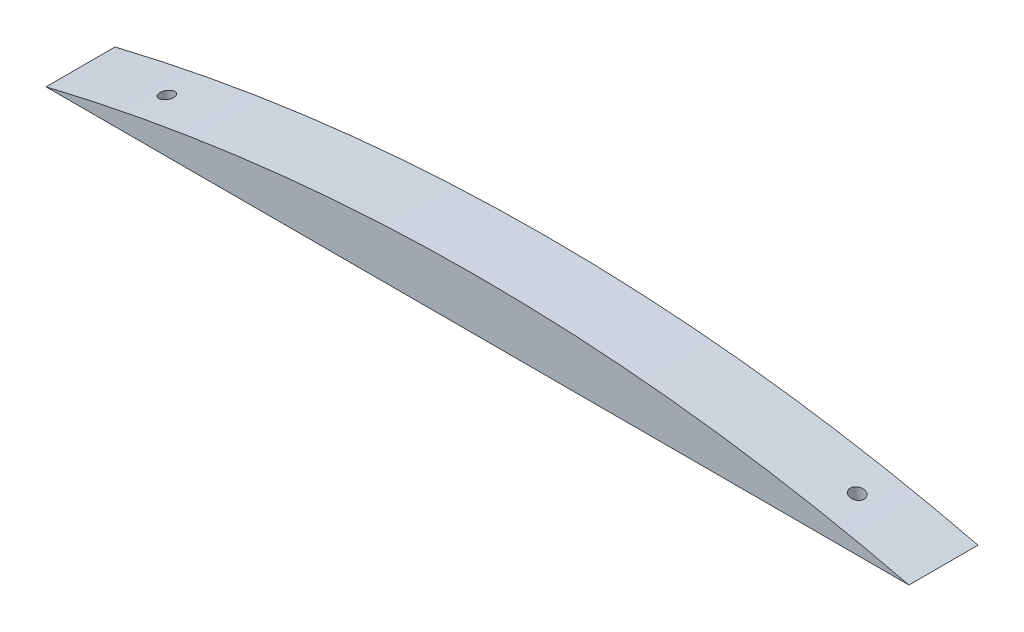
ISO-10303-21;
HEADER;
FILE_DESCRIPTION(('STEP AP214'),'2;1');
FILE_NAME('part.step','',(''),(''),'','','');
FILE_SCHEMA(('AUTOMOTIVE_DESIGN { 1 0 10303 214 1 1 1 1 }'));
ENDSEC;
DATA;
#1=APPLICATION_CONTEXT('core data for automotive mechanical design processes');
#2=APPLICATION_PROTOCOL_DEFINITION('international standard','automotive_design',2000,#1);
#3=PRODUCT_CONTEXT('',#1,'mechanical');
#4=PRODUCT('Part','Part','',(#3));
#5=PRODUCT_RELATED_PRODUCT_CATEGORY('part','',(#4));
#6=PRODUCT_DEFINITION_FORMATION('','',#4);
#7=PRODUCT_DEFINITION_CONTEXT('part definition',#1,'design');
#8=PRODUCT_DEFINITION('design','',#6,#7);
#9=PRODUCT_DEFINITION_SHAPE('','',#8);
#10=(LENGTH_UNIT() NAMED_UNIT(*) SI_UNIT(.MILLI.,.METRE.));
#11=(NAMED_UNIT(*) PLANE_ANGLE_UNIT() SI_UNIT($,.RADIAN.));
#12=(NAMED_UNIT(*) SI_UNIT($,.STERADIAN.) SOLID_ANGLE_UNIT());
#13=UNCERTAINTY_MEASURE_WITH_UNIT(LENGTH_MEASURE(1.E-05),#10,'distance_accuracy_value','');
#14=(GEOMETRIC_REPRESENTATION_CONTEXT(3) GLOBAL_UNCERTAINTY_ASSIGNED_CONTEXT((#13)) GLOBAL_UNIT_ASSIGNED_CONTEXT((#10,
#11,#12)) REPRESENTATION_CONTEXT('',''));
#15=CARTESIAN_POINT('',(0.,0.,0.));
#16=DIRECTION('',(0.,0.,1.));
#17=DIRECTION('',(1.,0.,0.));
#18=AXIS2_PLACEMENT_3D('',#15,#16,#17);
#19=CARTESIAN_POINT('',(0.,-653.137655014644,25.4));
#20=DIRECTION('',(0.,0.,-1.));
#21=DIRECTION('',(-1.,0.,0.));
#22=AXIS2_PLACEMENT_3D('',#19,#20,#21);
#23=CYLINDRICAL_SURFACE('',#22,672.153523309987);
#24=CARTESIAN_POINT('',(127.,6.90882736218701,10.1473));
#25=CARTESIAN_POINT('',(126.854700101575,6.93678454536345,10.1473061208971));
#26=CARTESIAN_POINT('',(126.709286225705,6.96471351699934,10.1597435254156));
#27=CARTESIAN_POINT('',(126.422409940531,7.01971604598845,10.2092369264156));
#28=CARTESIAN_POINT('',(126.280952492603,7.04678853443477,10.2463225057243));
#29=CARTESIAN_POINT('',(126.006153275248,7.09929321065845,10.344197011836));
#30=CARTESIAN_POINT('',(125.872810956681,7.12472550943216,10.4049843327083));
#31=CARTESIAN_POINT('',(125.618187510461,7.17321622814044,10.5486665503839));
#32=CARTESIAN_POINT('',(125.496902947135,7.19627532434909,10.631555124845));
#33=CARTESIAN_POINT('',(125.270989594477,7.23917013482297,10.8164084190503));
#34=CARTESIAN_POINT('',(125.166226156185,7.25903193835387,10.9182024193038));
#35=CARTESIAN_POINT('',(124.975322583409,7.29518571043773,11.1385262737965));
#36=CARTESIAN_POINT('',(124.889181544497,7.3114778523578,11.257055314808));
#37=CARTESIAN_POINT('',(124.739546486385,7.33975577424142,11.5053138013222));
#38=CARTESIAN_POINT('',(124.675691095118,7.35181029513668,11.6348176052773));
#39=CARTESIAN_POINT('',(124.570632275929,7.37163284612877,11.9030149295354));
#40=CARTESIAN_POINT('',(124.529426618924,7.37940129804143,12.0417075440112));
#41=CARTESIAN_POINT('',(124.471440733974,7.39033092126114,12.3220556362525));
#42=CARTESIAN_POINT('',(124.454295454136,7.39356095193723,12.4636330077915));
#43=CARTESIAN_POINT('',(124.443791960294,7.3955398911566,12.7476949764835));
#44=CARTESIAN_POINT('',(124.45043241606,7.39428905029467,12.8901795224576));
#45=CARTESIAN_POINT('',(124.487154718318,7.38736914850022,13.1709453755319));
#46=CARTESIAN_POINT('',(124.517069379925,7.38173159844247,13.3092493814936));
#47=CARTESIAN_POINT('',(124.599204714802,7.36624263841227,13.5788132657685));
#48=CARTESIAN_POINT('',(124.651425515297,7.35639120440586,13.7100731039004));
#49=CARTESIAN_POINT('',(124.776823109317,7.33271326810261,13.9624142615329));
#50=CARTESIAN_POINT('',(124.850080739021,7.31887143145508,14.083453941725));
#51=CARTESIAN_POINT('',(125.015272707523,7.28762276670692,14.3115096704759));
#52=CARTESIAN_POINT('',(125.107208116307,7.27021573436803,14.4185249150449));
#53=CARTESIAN_POINT('',(125.308404682925,7.23206961704948,14.6170329449244));
#54=CARTESIAN_POINT('',(125.417878268652,7.21128963078805,14.7083024991504));
#55=CARTESIAN_POINT('',(125.650099376491,7.16714231519868,14.8712135100901));
#56=CARTESIAN_POINT('',(125.772848059881,7.14377475951136,14.9428532476889));
#57=CARTESIAN_POINT('',(126.030381367178,7.09466722077415,15.0657597764567));
#58=CARTESIAN_POINT('',(126.165336117977,7.06889346092385,15.1166566441091));
#59=CARTESIAN_POINT('',(126.441639536331,7.01603199209656,15.1950225324117));
#60=CARTESIAN_POINT('',(126.582988741072,6.98894417271402,15.2224895809036));
#61=CARTESIAN_POINT('',(126.870190507144,6.9338072739755,15.2535423550247));
#62=CARTESIAN_POINT('',(127.016078434469,6.90575003742884,15.2567872870999));
#63=CARTESIAN_POINT('',(127.30632409582,6.84983016401336,15.2384227938138));
#64=CARTESIAN_POINT('',(127.450681760097,6.82196753603434,15.2168122404171));
#65=CARTESIAN_POINT('',(127.734479167796,6.76709775316887,15.1491220329108));
#66=CARTESIAN_POINT('',(127.873891964863,6.74009534906186,15.1029253698558));
#67=CARTESIAN_POINT('',(128.14303244057,6.68788324758169,14.9871839148885));
#68=CARTESIAN_POINT('',(128.272760315688,6.66267351384089,14.9176395967906));
#69=CARTESIAN_POINT('',(128.517817011597,6.61498431699523,14.7576134261498));
#70=CARTESIAN_POINT('',(128.633240742878,6.59248688776136,14.6672823694479));
#71=CARTESIAN_POINT('',(128.847247817205,6.55072410006355,14.4678626804833));
#72=CARTESIAN_POINT('',(128.94583256849,6.53145847132734,14.3587756183134));
#73=CARTESIAN_POINT('',(129.121634305426,6.49706994397843,14.1268082745688));
#74=CARTESIAN_POINT('',(129.19917103291,6.48188509441243,14.0041795540467));
#75=CARTESIAN_POINT('',(129.332504229616,6.45575526683165,13.7472090732067));
#76=CARTESIAN_POINT('',(129.388303076149,6.44480982518505,13.6128685956843));
#77=CARTESIAN_POINT('',(129.475560120204,6.42768684625079,13.3388886861255));
#78=CARTESIAN_POINT('',(129.507437868105,6.42142713142162,13.1993879336195));
#79=CARTESIAN_POINT('',(129.547465184423,6.41356633805432,12.9168971284652));
#80=CARTESIAN_POINT('',(129.555616573535,6.41196490205305,12.7739073444046));
#81=CARTESIAN_POINT('',(129.547975444709,6.41346579904888,12.4902242408473));
#82=CARTESIAN_POINT('',(129.532453321905,6.41651501306522,12.3495232640924));
#83=CARTESIAN_POINT('',(129.478456092184,6.42711743274922,12.0727773936751));
#84=CARTESIAN_POINT('',(129.439981255427,6.43467058540459,11.9367324452302));
#85=CARTESIAN_POINT('',(129.341251671023,6.45403840536872,11.6730382761214));
#86=CARTESIAN_POINT('',(129.280985283875,6.46585535008587,11.5453935854286));
#87=CARTESIAN_POINT('',(129.14051356388,6.4933719662133,11.3020670712205));
#88=CARTESIAN_POINT('',(129.060308046569,6.50907167354469,11.1863853583939));
#89=CARTESIAN_POINT('',(128.881267462921,6.54407596660032,10.9687580323191));
#90=CARTESIAN_POINT('',(128.782223362392,6.56342097600859,10.8669909799622));
#91=CARTESIAN_POINT('',(128.56899311307,6.60501048984521,10.6814564373152));
#92=CARTESIAN_POINT('',(128.454801936961,6.62725595689415,10.5976949473689));
#93=CARTESIAN_POINT('',(128.212316999387,6.67442140546855,10.4489623545031));
#94=CARTESIAN_POINT('',(128.083803208551,6.69938291710809,10.3843635929602));
#95=CARTESIAN_POINT('',(127.81815222857,6.7508939828394,10.2777386943378));
#96=CARTESIAN_POINT('',(127.681024487029,6.77744179560141,10.2356882934006));
#97=CARTESIAN_POINT('',(127.452585189602,6.82159045336088,10.1860896756876));
#98=CARTESIAN_POINT('',(127.362680788653,6.83894677893857,10.1715603966087));
#99=CARTESIAN_POINT('',(127.181865819833,6.87381487423845,10.1521635912739));
#100=CARTESIAN_POINT('',(127.090955241204,6.89132664562229,10.1472961684235));
#101=CARTESIAN_POINT('',(127.,6.90882736218701,10.1473));
#102=B_SPLINE_CURVE_WITH_KNOTS('',3,(#24,#25,#26,#27,#28,#29,#30,#31,#32,#33,#34,#35,#36,#37,
#38,#39,#40,#41,#42,#43,#44,#45,#46,#47,#48,#49,#50,#51,#52,#53,#54,#55,#56,#57,#58,#59,#60,#61,
#62,#63,#64,#65,#66,#67,#68,#69,#70,#71,#72,#73,#74,#75,#76,#77,#78,#79,#80,#81,#82,#83,#84,#85,
#86,#87,#88,#89,#90,#91,#92,#93,#94,#95,#96,#97,#98,#99,#100,#101),.UNSPECIFIED.,.T.,.F.,(4,2,2,
2,2,2,2,2,2,2,2,2,2,2,2,2,2,2,2,2,2,2,2,2,2,2,2,2,2,2,2,2,2,2,2,2,2,2,4),(0.,0.443560341001181,
0.887654008381628,1.33171759106241,1.77565427978665,2.21576154684627,2.65584743455292,
3.08842356539351,3.52095711641816,3.94685444221615,4.37272794988281,4.79557022343372,
5.2184149087052,5.64290667338703,6.06742276260177,6.49753525124427,6.92768539569553,
7.36520237650508,7.80275618079875,8.24645475681865,8.69017347034157,9.136023042675,
9.58186356754148,10.0245664152172,10.4672322216148,10.902740075394,11.3382002875342,
11.7658320133416,12.1934309230346,12.6161823105957,13.0389287223845,13.4619012697067,
13.8848777302772,14.3128547490817,14.7409741706469,15.1769365295542,15.6124288114767,
15.8900869961521,16.167748152436),.UNSPECIFIED.);
#103=CARTESIAN_POINT('',(127.,6.90882736218701,10.1473));
#104=VERTEX_POINT('',#103);
#105=EDGE_CURVE('E77',#104,#104,#102,.T.);
#106=ORIENTED_EDGE('',*,*,#105,.F.);
#107=EDGE_LOOP('',(#106));
#108=FACE_BOUND('',#107,.T.);
#109=CARTESIAN_POINT('',(-127.,6.90882736218701,10.1473));
#110=CARTESIAN_POINT('',(-127.14543521535,6.88084400067459,10.1473061451503));
#111=CARTESIAN_POINT('',(-127.290966652101,6.85279188915541,10.1597668194451));
#112=CARTESIAN_POINT('',(-127.578036842559,6.79736061718882,10.2093344366964));
#113=CARTESIAN_POINT('',(-127.719570509745,6.76998231929638,10.2464714229767));
#114=CARTESIAN_POINT('',(-127.994480004532,6.71671648546843,10.3444600604577));
#115=CARTESIAN_POINT('',(-128.127856723811,6.69082878660581,10.4053091141864));
#116=CARTESIAN_POINT('',(-128.382525477227,6.64132532455161,10.5491211398801));
#117=CARTESIAN_POINT('',(-128.503820963698,6.61770891238381,10.632077769333));
#118=CARTESIAN_POINT('',(-128.729803551915,6.57365286597026,10.817126984463));
#119=CARTESIAN_POINT('',(-128.834617169222,6.5531890596305,10.9190592018516));
#120=CARTESIAN_POINT('',(-129.025588444618,6.51586458302638,11.139695255032));
#121=CARTESIAN_POINT('',(-129.111747058079,6.49900372824636,11.2583982314362));
#122=CARTESIAN_POINT('',(-129.261327646595,6.46970834783496,11.506960730839));
#123=CARTESIAN_POINT('',(-129.325124437455,6.45720088107539,11.6365860858651));
#124=CARTESIAN_POINT('',(-129.430036657572,6.436622369683,11.9050403990413));
#125=CARTESIAN_POINT('',(-129.471154531581,6.42855084686263,12.0438683633565));
#126=CARTESIAN_POINT('',(-129.528886721489,6.41721553154857,12.3242874817643));
#127=CARTESIAN_POINT('',(-129.545899542418,6.41387355133042,12.4657935285936));
#128=CARTESIAN_POINT('',(-129.556165166585,6.41185714965416,12.7496939636543));
#129=CARTESIAN_POINT('',(-129.549419440209,6.41318243934475,12.8920882963662));
#130=CARTESIAN_POINT('',(-129.512535423732,6.42042613299615,13.1725344163853));
#131=CARTESIAN_POINT('',(-129.482583403214,6.42630796299991,13.3106117159567));
#132=CARTESIAN_POINT('',(-129.400451859279,6.44242632032016,13.5797156927915));
#133=CARTESIAN_POINT('',(-129.348272162078,6.45266288168352,13.7107423149211));
#134=CARTESIAN_POINT('',(-129.223008463757,6.47721523358998,13.9626918687753));
#135=CARTESIAN_POINT('',(-129.149833446401,6.49154878382945,14.0835677814336));
#136=CARTESIAN_POINT('',(-128.984869142185,6.52382595337149,14.3113184709069));
#137=CARTESIAN_POINT('',(-128.893078652425,6.54176980596524,14.4181923421982));
#138=CARTESIAN_POINT('',(-128.692089606361,6.58100894866929,14.6165953872837));
#139=CARTESIAN_POINT('',(-128.582657317939,6.60234917982776,14.707878824246));
#140=CARTESIAN_POINT('',(-128.350517116017,6.64755065517763,14.8708287392204));
#141=CARTESIAN_POINT('',(-128.227807957101,6.67141213586585,14.9424933746926));
#142=CARTESIAN_POINT('',(-127.970211137474,6.72142195625703,15.0655243871904));
#143=CARTESIAN_POINT('',(-127.835143194366,6.74760388046155,15.1164997330236));
#144=CARTESIAN_POINT('',(-127.558570329821,6.80112234828074,15.1949839301107));
#145=CARTESIAN_POINT('',(-127.41706486888,6.82845898865392,15.2224908107332));
#146=CARTESIAN_POINT('',(-127.129549073099,6.8839040027096,15.2535633839803));
#147=CARTESIAN_POINT('',(-126.983503548178,6.91201781943827,15.2567946267706));
#148=CARTESIAN_POINT('',(-126.692914914658,6.96785632773291,15.2383407148004));
#149=CARTESIAN_POINT('',(-126.548371863118,6.99558100453424,15.2166546172061));
#150=CARTESIAN_POINT('',(-126.264387063234,7.049958046608,15.1487827289787));
#151=CARTESIAN_POINT('',(-126.124964822342,7.07660634355917,15.1025119243332));
#152=CARTESIAN_POINT('',(-125.855805483273,7.12796874025259,14.9866053275011));
#153=CARTESIAN_POINT('',(-125.726068107605,7.15268289541264,14.9169702050607));
#154=CARTESIAN_POINT('',(-125.481150146862,7.19927057154994,14.7568431645203));
#155=CARTESIAN_POINT('',(-125.365859371249,7.22116563546251,14.66652615549));
#156=CARTESIAN_POINT('',(-125.152107276154,7.26170961330247,14.4671788264668));
#157=CARTESIAN_POINT('',(-125.053644547101,7.28035879911738,14.3581500753639));
#158=CARTESIAN_POINT('',(-124.878052122922,7.31358382038004,14.1263308569729));
#159=CARTESIAN_POINT('',(-124.800606068633,7.32822010057348,14.003788713471));
#160=CARTESIAN_POINT('',(-124.667426524602,7.35337162969296,13.7470367979591));
#161=CARTESIAN_POINT('',(-124.61169084416,7.36388729441314,13.6128282048326));
#162=CARTESIAN_POINT('',(-124.524457937646,7.38033885371042,13.3389663181981));
#163=CARTESIAN_POINT('',(-124.492571685132,7.38634825774493,13.1994412867509));
#164=CARTESIAN_POINT('',(-124.45253470309,7.39389300424836,12.9169103965164));
#165=CARTESIAN_POINT('',(-124.444382342346,7.39542865419569,12.773904777629));
#166=CARTESIAN_POINT('',(-124.452031141687,7.39398756840853,12.4900221064918));
#167=CARTESIAN_POINT('',(-124.467589396434,7.39105659140902,12.3491382022699));
#168=CARTESIAN_POINT('',(-124.521722083137,7.38085371666659,12.0720310098747));
#169=CARTESIAN_POINT('',(-124.560296256714,7.37358186765449,11.9358076693998));
#170=CARTESIAN_POINT('',(-124.659289149477,7.35490591821248,11.6717790197272));
#171=CARTESIAN_POINT('',(-124.719718332774,7.34349983831985,11.5439777777159));
#172=CARTESIAN_POINT('',(-124.86058090983,7.31688494199142,11.3003707642209));
#173=CARTESIAN_POINT('',(-124.941014363653,7.30167611413759,11.1845650287562));
#174=CARTESIAN_POINT('',(-125.120464167303,7.26770288987267,10.9668722068559));
#175=CARTESIAN_POINT('',(-125.219669039499,7.24890240196704,10.8651462340831));
#176=CARTESIAN_POINT('',(-125.433225970689,7.20837284674557,10.6797276525723));
#177=CARTESIAN_POINT('',(-125.547582956779,7.18664282677728,10.5960409331098));
#178=CARTESIAN_POINT('',(-125.790240970143,7.14046038562625,10.4475920298746));
#179=CARTESIAN_POINT('',(-125.918746943549,7.11596777686897,10.3831778008979));
#180=CARTESIAN_POINT('',(-126.184328091871,7.06526261838261,10.2769081808975));
#181=CARTESIAN_POINT('',(-126.321393840054,7.03905195918804,10.2350284454403));
#182=CARTESIAN_POINT('',(-126.549383468801,6.99537750449861,10.1857498961179));
#183=CARTESIAN_POINT('',(-126.638911875533,6.97820852450756,10.1713466745989));
#184=CARTESIAN_POINT('',(-126.818947749852,6.9436443678006,10.1521197665417));
#185=CARTESIAN_POINT('',(-126.909455227054,6.92624918886301,10.1472961741643));
#186=CARTESIAN_POINT('',(-127.,6.90882736218701,10.1473));
#187=B_SPLINE_CURVE_WITH_KNOTS('',3,(#109,#110,#111,#112,#113,#114,#115,#116,#117,#118,#119,
#120,#121,#122,#123,#124,#125,#126,#127,#128,#129,#130,#131,#132,#133,#134,#135,#136,#137,#138,
#139,#140,#141,#142,#143,#144,#145,#146,#147,#148,#149,#150,#151,#152,#153,#154,#155,#156,#157,
#158,#159,#160,#161,#162,#163,#164,#165,#166,#167,#168,#169,#170,#171,#172,#173,#174,#175,#176,
#177,#178,#179,#180,#181,#182,#183,#184,#185,#186),.UNSPECIFIED.,.T.,.F.,(4,2,2,2,2,2,2,2,2,2,2,
2,2,2,2,2,2,2,2,2,2,2,2,2,2,2,2,2,2,2,2,2,2,2,2,2,2,2,4),(0.,0.443974836488026,
0.888491203642314,1.33295889118079,1.77729920100468,2.21804199766639,2.65876221743589,
3.09169579244634,3.52458268876223,3.95022609387621,4.37584315693243,4.79807887617756,
5.22031789667401,5.64441574983438,6.06854101623326,6.49883376627371,6.92916691428367,
7.36729199956761,7.80545387030177,8.24964149537581,8.6938459283798,9.13959651586604,
9.58533432684903,10.0274332772865,10.4694951779342,10.9044783236832,11.3394175657862,
11.7670974357604,12.1947479108612,12.6180466417974,13.0413406208521,13.4648375406512,
13.8883357320471,14.3163375896019,14.7444789660185,15.1799390917223,15.6149278323795,
15.8913341039995,16.1677430924754),.UNSPECIFIED.);
#188=CARTESIAN_POINT('',(-127.,6.90882736218701,10.1473));
#189=VERTEX_POINT('',#188);
#190=EDGE_CURVE('E80',#189,#189,#187,.T.);
#191=ORIENTED_EDGE('',*,*,#190,.F.);
#192=EDGE_LOOP('',(#191));
#193=FACE_BOUND('',#192,.T.);
#194=CARTESIAN_POINT('',(0.,-653.137655014644,0.));
#195=DIRECTION('',(0.,0.,1.));
#196=DIRECTION('',(1.,0.,0.));
#197=AXIS2_PLACEMENT_3D('',#194,#195,#196);
#198=CIRCLE('',#197,672.153523309987);
#199=CARTESIAN_POINT('',(-158.75,0.,0.));
#200=VERTEX_POINT('',#199);
#201=CARTESIAN_POINT('',(158.75,0.,0.));
#202=VERTEX_POINT('',#201);
#203=EDGE_CURVE('E70',#200,#202,#198,.F.);
#204=ORIENTED_EDGE('',*,*,#203,.F.);
#205=DIRECTION('',(0.,0.,-1.));
#206=VECTOR('',#205,1.);
#207=CARTESIAN_POINT('',(-158.75,0.,25.4));
#208=LINE('',#207,#206);
#209=CARTESIAN_POINT('',(-158.75,0.,25.4));
#210=VERTEX_POINT('',#209);
#211=EDGE_CURVE('E11',#210,#200,#208,.T.);
#212=ORIENTED_EDGE('',*,*,#211,.F.);
#213=CARTESIAN_POINT('',(0.,-653.137655014644,25.4));
#214=DIRECTION('',(0.,0.,1.));
#215=DIRECTION('',(1.,0.,0.));
#216=AXIS2_PLACEMENT_3D('',#213,#214,#215);
#217=CIRCLE('',#216,672.153523309987);
#218=CARTESIAN_POINT('',(158.75,0.,25.4));
#219=VERTEX_POINT('',#218);
#220=EDGE_CURVE('E71',#210,#219,#217,.F.);
#221=ORIENTED_EDGE('',*,*,#220,.T.);
#222=DIRECTION('',(0.,0.,-1.));
#223=VECTOR('',#222,1.);
#224=CARTESIAN_POINT('',(158.75,0.,25.4));
#225=LINE('',#224,#223);
#226=EDGE_CURVE('E50',#219,#202,#225,.T.);
#227=ORIENTED_EDGE('',*,*,#226,.T.);
#228=EDGE_LOOP('',(#204,#212,#221,#227));
#229=FACE_BOUND('',#228,.T.);
#230=ADVANCED_FACE('F41',(#108,#193,#229),#23,.T.);
#231=CARTESIAN_POINT('',(0.,0.,25.4));
#232=DIRECTION('',(0.,1.,0.));
#233=DIRECTION('',(0.,0.,1.));
#234=AXIS2_PLACEMENT_3D('',#231,#232,#233);
#235=PLANE('',#234);
#236=CARTESIAN_POINT('',(127.,0.,12.7));
#237=DIRECTION('',(0.,-1.,0.));
#238=DIRECTION('',(0.,0.,-1.));
#239=AXIS2_PLACEMENT_3D('',#236,#237,#238);
#240=CIRCLE('',#239,2.55269999999998);
#241=CARTESIAN_POINT('',(127.,0.,10.1473));
#242=VERTEX_POINT('',#241);
#243=EDGE_CURVE('E116',#242,#242,#240,.T.);
#244=ORIENTED_EDGE('',*,*,#243,.F.);
#245=EDGE_LOOP('',(#244));
#246=FACE_BOUND('',#245,.T.);
#247=CARTESIAN_POINT('',(-127.,0.,12.7));
#248=DIRECTION('',(0.,-1.,0.));
#249=DIRECTION('',(0.,0.,-1.));
#250=AXIS2_PLACEMENT_3D('',#247,#248,#249);
#251=CIRCLE('',#250,2.55270000000001);
#252=CARTESIAN_POINT('',(-127.,0.,10.1473));
#253=VERTEX_POINT('',#252);
#254=EDGE_CURVE('E119',#253,#253,#251,.T.);
#255=ORIENTED_EDGE('',*,*,#254,.F.);
#256=EDGE_LOOP('',(#255));
#257=FACE_BOUND('',#256,.T.);
#258=DIRECTION('',(1.,0.,0.));
#259=VECTOR('',#258,1.);
#260=CARTESIAN_POINT('',(0.,0.,0.));
#261=LINE('',#260,#259);
#262=EDGE_CURVE('E72',#200,#202,#261,.T.);
#263=ORIENTED_EDGE('',*,*,#262,.T.);
#264=ORIENTED_EDGE('',*,*,#226,.F.);
#265=DIRECTION('',(1.,0.,0.));
#266=VECTOR('',#265,1.);
#267=CARTESIAN_POINT('',(0.,0.,25.4));
#268=LINE('',#267,#266);
#269=EDGE_CURVE('E57',#210,#219,#268,.T.);
#270=ORIENTED_EDGE('',*,*,#269,.F.);
#271=ORIENTED_EDGE('',*,*,#211,.T.);
#272=EDGE_LOOP('',(#263,#264,#270,#271));
#273=FACE_BOUND('',#272,.T.);
#274=ADVANCED_FACE('F73',(#246,#257,#273),#235,.F.);
#275=CARTESIAN_POINT('',(0.,0.,25.4));
#276=DIRECTION('',(0.,0.,1.));
#277=DIRECTION('',(1.,0.,0.));
#278=AXIS2_PLACEMENT_3D('',#275,#276,#277);
#279=PLANE('',#278);
#280=ORIENTED_EDGE('',*,*,#220,.F.);
#281=ORIENTED_EDGE('',*,*,#269,.T.);
#282=EDGE_LOOP('',(#280,#281));
#283=FACE_BOUND('',#282,.T.);
#284=ADVANCED_FACE('F103',(#283),#279,.T.);
#285=CARTESIAN_POINT('',(0.,0.,0.));
#286=DIRECTION('',(0.,0.,1.));
#287=DIRECTION('',(1.,0.,0.));
#288=AXIS2_PLACEMENT_3D('',#285,#286,#287);
#289=PLANE('',#288);
#290=ORIENTED_EDGE('',*,*,#203,.T.);
#291=ORIENTED_EDGE('',*,*,#262,.F.);
#292=EDGE_LOOP('',(#290,#291));
#293=FACE_BOUND('',#292,.T.);
#294=ADVANCED_FACE('F76',(#293),#289,.F.);
#295=CARTESIAN_POINT('',(-127.,12.7,12.7));
#296=DIRECTION('',(0.,-1.,0.));
#297=DIRECTION('',(0.,0.,-1.));
#298=AXIS2_PLACEMENT_3D('',#295,#296,#297);
#299=CYLINDRICAL_SURFACE('',#298,2.55270000000001);
#300=ORIENTED_EDGE('',*,*,#190,.T.);
#301=EDGE_LOOP('',(#300));
#302=FACE_BOUND('',#301,.T.);
#303=ORIENTED_EDGE('',*,*,#254,.T.);
#304=EDGE_LOOP('',(#303));
#305=FACE_BOUND('',#304,.T.);
#306=ADVANCED_FACE('F97',(#302,#305),#299,.F.);
#307=CARTESIAN_POINT('',(127.,12.7,12.7));
#308=DIRECTION('',(0.,-1.,0.));
#309=DIRECTION('',(0.,0.,-1.));
#310=AXIS2_PLACEMENT_3D('',#307,#308,#309);
#311=CYLINDRICAL_SURFACE('',#310,2.55269999999998);
#312=ORIENTED_EDGE('',*,*,#105,.T.);
#313=EDGE_LOOP('',(#312));
#314=FACE_BOUND('',#313,.T.);
#315=ORIENTED_EDGE('',*,*,#243,.T.);
#316=EDGE_LOOP('',(#315));
#317=FACE_BOUND('',#316,.T.);
#318=ADVANCED_FACE('F94',(#314,#317),#311,.F.);
#319=CLOSED_SHELL('',(#230,#274,#284,#294,#306,#318));
#320=MANIFOLD_SOLID_BREP('B2',#319);
#321=ADVANCED_BREP_SHAPE_REPRESENTATION('',(#18,#320),#14);
#322=SHAPE_DEFINITION_REPRESENTATION(#9,#321);
ENDSEC;
END-ISO-10303-21;
